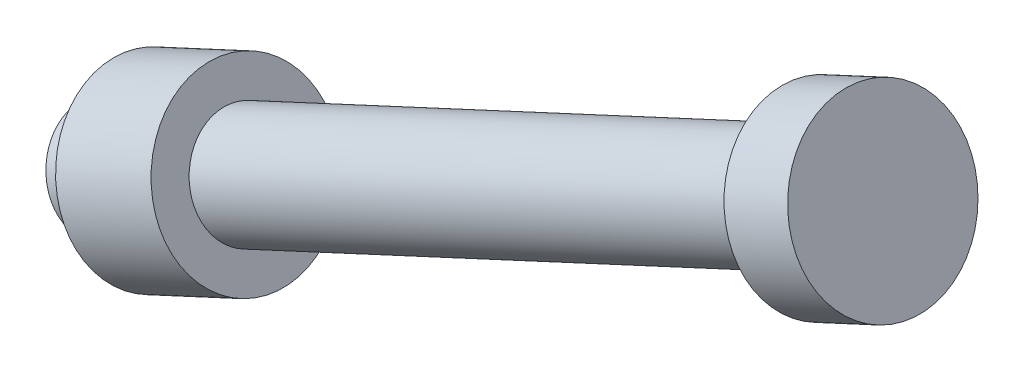
ISO-10303-21;
HEADER;
FILE_DESCRIPTION(('STEP AP214'),'2;1');
FILE_NAME('part.step','',(''),(''),'','','');
FILE_SCHEMA(('AUTOMOTIVE_DESIGN { 1 0 10303 214 1 1 1 1 }'));
ENDSEC;
DATA;
#1=APPLICATION_CONTEXT('core data for automotive mechanical design processes');
#2=APPLICATION_PROTOCOL_DEFINITION('international standard','automotive_design',2000,#1);
#3=PRODUCT_CONTEXT('',#1,'mechanical');
#4=PRODUCT('Part','Part','',(#3));
#5=PRODUCT_RELATED_PRODUCT_CATEGORY('part','',(#4));
#6=PRODUCT_DEFINITION_FORMATION('','',#4);
#7=PRODUCT_DEFINITION_CONTEXT('part definition',#1,'design');
#8=PRODUCT_DEFINITION('design','',#6,#7);
#9=PRODUCT_DEFINITION_SHAPE('','',#8);
#10=(LENGTH_UNIT() NAMED_UNIT(*) SI_UNIT(.MILLI.,.METRE.));
#11=(NAMED_UNIT(*) PLANE_ANGLE_UNIT() SI_UNIT($,.RADIAN.));
#12=(NAMED_UNIT(*) SI_UNIT($,.STERADIAN.) SOLID_ANGLE_UNIT());
#13=UNCERTAINTY_MEASURE_WITH_UNIT(LENGTH_MEASURE(1.E-05),#10,'distance_accuracy_value','');
#14=(GEOMETRIC_REPRESENTATION_CONTEXT(3) GLOBAL_UNCERTAINTY_ASSIGNED_CONTEXT((#13)) GLOBAL_UNIT_ASSIGNED_CONTEXT((#10,
#11,#12)) REPRESENTATION_CONTEXT('',''));
#15=CARTESIAN_POINT('',(0.,0.,0.));
#16=DIRECTION('',(0.,0.,1.));
#17=DIRECTION('',(1.,0.,0.));
#18=AXIS2_PLACEMENT_3D('',#15,#16,#17);
#19=CARTESIAN_POINT('',(436.593406424835,392.886366662994,0.));
#20=DIRECTION('',(0.907075325544676,0.420968352477974,0.));
#21=DIRECTION('',(-0.420968352477974,0.907075325544676,0.));
#22=AXIS2_PLACEMENT_3D('',#19,#20,#21);
#23=PLANE('',#22);
#24=CARTESIAN_POINT('',(436.593406424835,392.886366662994,0.));
#25=DIRECTION('',(0.907075325544678,0.42096835247797,0.));
#26=DIRECTION('',(-0.42096835247797,0.907075325544678,0.));
#27=AXIS2_PLACEMENT_3D('',#24,#25,#26);
#28=CIRCLE('',#27,3.);
#29=CARTESIAN_POINT('',(435.330501367401,395.607592639628,0.));
#30=VERTEX_POINT('',#29);
#31=EDGE_CURVE('E67',#30,#30,#28,.T.);
#32=ORIENTED_EDGE('',*,*,#31,.T.);
#33=EDGE_LOOP('',(#32));
#34=FACE_BOUND('',#33,.T.);
#35=CARTESIAN_POINT('',(436.593406424835,392.886366662994,0.));
#36=DIRECTION('',(0.907075325544676,0.420968352477974,0.));
#37=DIRECTION('',(-0.420968352477974,0.907075325544676,0.));
#38=AXIS2_PLACEMENT_3D('',#35,#36,#37);
#39=CIRCLE('',#38,5.);
#40=CARTESIAN_POINT('',(434.488564662446,397.421743290717,0.));
#41=VERTEX_POINT('',#40);
#42=EDGE_CURVE('E62',#41,#41,#39,.T.);
#43=ORIENTED_EDGE('',*,*,#42,.F.);
#44=EDGE_LOOP('',(#43));
#45=FACE_BOUND('',#44,.T.);
#46=ADVANCED_FACE('F51',(#34,#45),#23,.F.);
#47=CARTESIAN_POINT('',(440.221707727014,394.570240072906,0.));
#48=DIRECTION('',(0.907075325544676,0.420968352477974,0.));
#49=DIRECTION('',(-0.420968352477974,0.907075325544676,0.));
#50=AXIS2_PLACEMENT_3D('',#47,#48,#49);
#51=PLANE('',#50);
#52=CARTESIAN_POINT('',(440.221707727014,394.570240072906,0.));
#53=DIRECTION('',(0.907075325544676,0.420968352477974,0.));
#54=DIRECTION('',(-0.420968352477974,0.907075325544676,0.));
#55=AXIS2_PLACEMENT_3D('',#52,#53,#54);
#56=CIRCLE('',#55,5.);
#57=CARTESIAN_POINT('',(438.116865964624,399.105616700629,0.));
#58=VERTEX_POINT('',#57);
#59=EDGE_CURVE('E58',#58,#58,#56,.T.);
#60=ORIENTED_EDGE('',*,*,#59,.T.);
#61=EDGE_LOOP('',(#60));
#62=FACE_BOUND('',#61,.T.);
#63=ADVANCED_FACE('F103',(#62),#51,.T.);
#64=CARTESIAN_POINT('',(436.593406424835,392.886366662994,0.));
#65=DIRECTION('',(0.907075325544676,0.420968352477975,0.));
#66=DIRECTION('',(-0.420968352477975,0.907075325544676,0.));
#67=AXIS2_PLACEMENT_3D('',#64,#65,#66);
#68=CYLINDRICAL_SURFACE('',#67,5.);
#69=ORIENTED_EDGE('',*,*,#59,.F.);
#70=EDGE_LOOP('',(#69));
#71=FACE_BOUND('',#70,.T.);
#72=ORIENTED_EDGE('',*,*,#42,.T.);
#73=EDGE_LOOP('',(#72));
#74=FACE_BOUND('',#73,.T.);
#75=ADVANCED_FACE('F94',(#71,#74),#68,.T.);
#76=CARTESIAN_POINT('',(395.775016775325,373.942790801485,0.));
#77=DIRECTION('',(0.90707532554468,0.420968352477967,0.));
#78=DIRECTION('',(-0.420968352477967,0.90707532554468,0.));
#79=AXIS2_PLACEMENT_3D('',#76,#77,#78);
#80=CYLINDRICAL_SURFACE('',#79,3.);
#81=CARTESIAN_POINT('',(403.938694705227,377.731505973787,0.));
#82=DIRECTION('',(0.907075325544684,0.420968352477958,0.));
#83=DIRECTION('',(-0.420968352477958,0.907075325544684,0.));
#84=AXIS2_PLACEMENT_3D('',#81,#82,#83);
#85=CIRCLE('',#84,3.);
#86=CARTESIAN_POINT('',(402.675789647793,380.452731950421,0.));
#87=VERTEX_POINT('',#86);
#88=EDGE_CURVE('E11',#87,#87,#85,.F.);
#89=ORIENTED_EDGE('',*,*,#88,.F.);
#90=EDGE_LOOP('',(#89));
#91=FACE_BOUND('',#90,.T.);
#92=ORIENTED_EDGE('',*,*,#31,.F.);
#93=EDGE_LOOP('',(#92));
#94=FACE_BOUND('',#93,.T.);
#95=ADVANCED_FACE('F85',(#91,#94),#80,.T.);
#96=CARTESIAN_POINT('',(398.496242751959,375.205695858919,0.));
#97=DIRECTION('',(0.907075325544684,0.420968352477958,0.));
#98=DIRECTION('',(-0.420968352477958,0.907075325544684,0.));
#99=AXIS2_PLACEMENT_3D('',#96,#97,#98);
#100=PLANE('',#99);
#101=CARTESIAN_POINT('',(398.496242751959,375.205695858919,0.));
#102=DIRECTION('',(0.907075325544684,0.420968352477958,0.));
#103=DIRECTION('',(-0.420968352477958,0.907075325544684,0.));
#104=AXIS2_PLACEMENT_3D('',#101,#102,#103);
#105=CIRCLE('',#104,3.);
#106=CARTESIAN_POINT('',(397.233337694525,377.926921835553,0.));
#107=VERTEX_POINT('',#106);
#108=EDGE_CURVE('E54',#107,#107,#105,.F.);
#109=ORIENTED_EDGE('',*,*,#108,.F.);
#110=EDGE_LOOP('',(#109));
#111=FACE_BOUND('',#110,.T.);
#112=CARTESIAN_POINT('',(398.496242751959,375.205695858919,0.));
#113=DIRECTION('',(0.907075325544684,0.420968352477958,0.));
#114=DIRECTION('',(-0.420968352477958,0.907075325544684,0.));
#115=AXIS2_PLACEMENT_3D('',#112,#113,#114);
#116=CIRCLE('',#115,5.);
#117=CARTESIAN_POINT('',(396.391400989569,379.741072486642,0.));
#118=VERTEX_POINT('',#117);
#119=EDGE_CURVE('E76',#118,#118,#116,.T.);
#120=ORIENTED_EDGE('',*,*,#119,.F.);
#121=EDGE_LOOP('',(#120));
#122=FACE_BOUND('',#121,.T.);
#123=ADVANCED_FACE('F82',(#111,#122),#100,.F.);
#124=CARTESIAN_POINT('',(403.938694705227,377.731505973787,0.));
#125=DIRECTION('',(0.907075325544684,0.420968352477958,0.));
#126=DIRECTION('',(-0.420968352477958,0.907075325544684,0.));
#127=AXIS2_PLACEMENT_3D('',#124,#125,#126);
#128=PLANE('',#127);
#129=ORIENTED_EDGE('',*,*,#88,.T.);
#130=EDGE_LOOP('',(#129));
#131=FACE_BOUND('',#130,.T.);
#132=CARTESIAN_POINT('',(403.938694705227,377.731505973787,0.));
#133=DIRECTION('',(0.907075325544684,0.420968352477958,0.));
#134=DIRECTION('',(-0.420968352477958,0.907075325544684,0.));
#135=AXIS2_PLACEMENT_3D('',#132,#133,#134);
#136=CIRCLE('',#135,5.);
#137=CARTESIAN_POINT('',(401.833852942837,382.26688260151,0.));
#138=VERTEX_POINT('',#137);
#139=EDGE_CURVE('E73',#138,#138,#136,.T.);
#140=ORIENTED_EDGE('',*,*,#139,.T.);
#141=EDGE_LOOP('',(#140));
#142=FACE_BOUND('',#141,.T.);
#143=ADVANCED_FACE('F84',(#131,#142),#128,.T.);
#144=CARTESIAN_POINT('',(398.496242751959,375.205695858919,0.));
#145=DIRECTION('',(0.90707532554468,0.420968352477966,0.));
#146=DIRECTION('',(-0.420968352477966,0.90707532554468,0.));
#147=AXIS2_PLACEMENT_3D('',#144,#145,#146);
#148=CYLINDRICAL_SURFACE('',#147,5.);
#149=ORIENTED_EDGE('',*,*,#139,.F.);
#150=EDGE_LOOP('',(#149));
#151=FACE_BOUND('',#150,.T.);
#152=ORIENTED_EDGE('',*,*,#119,.T.);
#153=EDGE_LOOP('',(#152));
#154=FACE_BOUND('',#153,.T.);
#155=ADVANCED_FACE('F80',(#151,#154),#148,.T.);
#156=CARTESIAN_POINT('',(395.775016775325,373.942790801485,0.));
#157=DIRECTION('',(0.907075325544678,0.42096835247797,0.));
#158=DIRECTION('',(-0.42096835247797,0.907075325544678,0.));
#159=AXIS2_PLACEMENT_3D('',#156,#157,#158);
#160=PLANE('',#159);
#161=CARTESIAN_POINT('',(395.775016775325,373.942790801485,0.));
#162=DIRECTION('',(0.907075325544678,0.42096835247797,0.));
#163=DIRECTION('',(-0.42096835247797,0.907075325544678,0.));
#164=AXIS2_PLACEMENT_3D('',#161,#162,#163);
#165=CIRCLE('',#164,3.);
#166=CARTESIAN_POINT('',(394.512111717891,376.664016778119,0.));
#167=VERTEX_POINT('',#166);
#168=EDGE_CURVE('E70',#167,#167,#165,.T.);
#169=ORIENTED_EDGE('',*,*,#168,.F.);
#170=EDGE_LOOP('',(#169));
#171=FACE_BOUND('',#170,.T.);
#172=ADVANCED_FACE('F88',(#171),#160,.F.);
#173=ORIENTED_EDGE('',*,*,#168,.T.);
#174=EDGE_LOOP('',(#173));
#175=FACE_BOUND('',#174,.T.);
#176=ORIENTED_EDGE('',*,*,#108,.T.);
#177=EDGE_LOOP('',(#176));
#178=FACE_BOUND('',#177,.T.);
#179=ADVANCED_FACE('F97',(#175,#178),#80,.T.);
#180=CLOSED_SHELL('',(#46,#63,#75,#95,#123,#143,#155,#172,#179));
#181=MANIFOLD_SOLID_BREP('B2',#180);
#182=ADVANCED_BREP_SHAPE_REPRESENTATION('',(#18,#181),#14);
#183=SHAPE_DEFINITION_REPRESENTATION(#9,#182);
ENDSEC;
END-ISO-10303-21;
